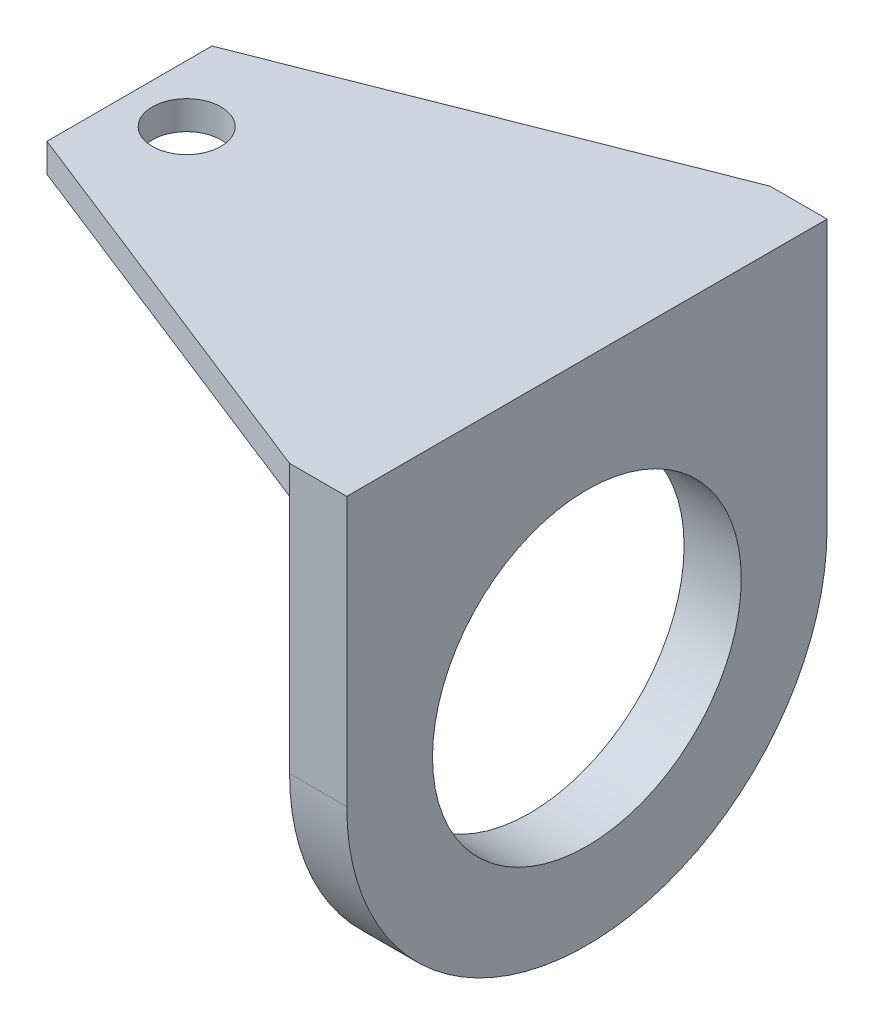
ISO-10303-21;
HEADER;
FILE_DESCRIPTION(('STEP AP214'),'2;1');
FILE_NAME('part.step','',(''),(''),'','','');
FILE_SCHEMA(('AUTOMOTIVE_DESIGN { 1 0 10303 214 1 1 1 1 }'));
ENDSEC;
DATA;
#1=APPLICATION_CONTEXT('core data for automotive mechanical design processes');
#2=APPLICATION_PROTOCOL_DEFINITION('international standard','automotive_design',2000,#1);
#3=PRODUCT_CONTEXT('',#1,'mechanical');
#4=PRODUCT('Part','Part','',(#3));
#5=PRODUCT_RELATED_PRODUCT_CATEGORY('part','',(#4));
#6=PRODUCT_DEFINITION_FORMATION('','',#4);
#7=PRODUCT_DEFINITION_CONTEXT('part definition',#1,'design');
#8=PRODUCT_DEFINITION('design','',#6,#7);
#9=PRODUCT_DEFINITION_SHAPE('','',#8);
#10=(LENGTH_UNIT() NAMED_UNIT(*) SI_UNIT(.MILLI.,.METRE.));
#11=(NAMED_UNIT(*) PLANE_ANGLE_UNIT() SI_UNIT($,.RADIAN.));
#12=(NAMED_UNIT(*) SI_UNIT($,.STERADIAN.) SOLID_ANGLE_UNIT());
#13=UNCERTAINTY_MEASURE_WITH_UNIT(LENGTH_MEASURE(1.E-05),#10,'distance_accuracy_value','');
#14=(GEOMETRIC_REPRESENTATION_CONTEXT(3) GLOBAL_UNCERTAINTY_ASSIGNED_CONTEXT((#13)) GLOBAL_UNIT_ASSIGNED_CONTEXT((#10,
#11,#12)) REPRESENTATION_CONTEXT('',''));
#15=CARTESIAN_POINT('',(0.,0.,0.));
#16=DIRECTION('',(0.,0.,1.));
#17=DIRECTION('',(1.,0.,0.));
#18=AXIS2_PLACEMENT_3D('',#15,#16,#17);
#19=CARTESIAN_POINT('',(0.,-21.001,21.));
#20=DIRECTION('',(0.,0.,-1.));
#21=DIRECTION('',(-1.,0.,0.));
#22=AXIS2_PLACEMENT_3D('',#19,#20,#21);
#23=PLANE('',#22);
#24=DIRECTION('',(0.,-1.,0.));
#25=VECTOR('',#24,1.);
#26=CARTESIAN_POINT('',(0.,23.5,21.));
#27=LINE('',#26,#25);
#28=CARTESIAN_POINT('',(0.,23.5,21.));
#29=VERTEX_POINT('',#28);
#30=CARTESIAN_POINT('',(0.,21.,21.));
#31=VERTEX_POINT('',#30);
#32=EDGE_CURVE('E50',#29,#31,#27,.T.);
#33=ORIENTED_EDGE('',*,*,#32,.T.);
#34=DIRECTION('',(0.,1.,0.));
#35=VECTOR('',#34,1.);
#36=CARTESIAN_POINT('',(0.,-21.001,21.));
#37=LINE('',#36,#35);
#38=CARTESIAN_POINT('',(0.,0.,21.));
#39=VERTEX_POINT('',#38);
#40=EDGE_CURVE('E145',#39,#31,#37,.T.);
#41=ORIENTED_EDGE('',*,*,#40,.F.);
#42=DIRECTION('',(-1.,0.,0.));
#43=VECTOR('',#42,1.);
#44=CARTESIAN_POINT('',(5.,0.,21.));
#45=LINE('',#44,#43);
#46=CARTESIAN_POINT('',(5.,0.,21.));
#47=VERTEX_POINT('',#46);
#48=EDGE_CURVE('E139',#39,#47,#45,.F.);
#49=ORIENTED_EDGE('',*,*,#48,.T.);
#50=DIRECTION('',(0.,1.,0.));
#51=VECTOR('',#50,1.);
#52=CARTESIAN_POINT('',(5.,-21.001,21.));
#53=LINE('',#52,#51);
#54=CARTESIAN_POINT('',(5.,23.5,21.));
#55=VERTEX_POINT('',#54);
#56=EDGE_CURVE('E142',#47,#55,#53,.T.);
#57=ORIENTED_EDGE('',*,*,#56,.T.);
#58=DIRECTION('',(-1.,0.,0.));
#59=VECTOR('',#58,1.);
#60=CARTESIAN_POINT('',(0.,23.5,21.));
#61=LINE('',#60,#59);
#62=EDGE_CURVE('E114',#55,#29,#61,.T.);
#63=ORIENTED_EDGE('',*,*,#62,.T.);
#64=EDGE_LOOP('',(#33,#41,#49,#57,#63));
#65=FACE_BOUND('',#64,.T.);
#66=ADVANCED_FACE('F35',(#65),#23,.F.);
#67=CARTESIAN_POINT('',(0.,-21.001,-21.));
#68=DIRECTION('',(0.,0.,1.));
#69=DIRECTION('',(1.,0.,0.));
#70=AXIS2_PLACEMENT_3D('',#67,#68,#69);
#71=PLANE('',#70);
#72=DIRECTION('',(0.,-1.,0.));
#73=VECTOR('',#72,1.);
#74=CARTESIAN_POINT('',(0.,23.5,-21.));
#75=LINE('',#74,#73);
#76=CARTESIAN_POINT('',(0.,23.5,-21.));
#77=VERTEX_POINT('',#76);
#78=CARTESIAN_POINT('',(0.,21.,-21.));
#79=VERTEX_POINT('',#78);
#80=EDGE_CURVE('E197',#77,#79,#75,.T.);
#81=ORIENTED_EDGE('',*,*,#80,.F.);
#82=DIRECTION('',(1.,0.,0.));
#83=VECTOR('',#82,1.);
#84=CARTESIAN_POINT('',(0.,23.5,-21.));
#85=LINE('',#84,#83);
#86=CARTESIAN_POINT('',(5.,23.5,-21.));
#87=VERTEX_POINT('',#86);
#88=EDGE_CURVE('E115',#77,#87,#85,.T.);
#89=ORIENTED_EDGE('',*,*,#88,.T.);
#90=DIRECTION('',(0.,1.,0.));
#91=VECTOR('',#90,1.);
#92=CARTESIAN_POINT('',(5.,-21.001,-21.));
#93=LINE('',#92,#91);
#94=CARTESIAN_POINT('',(5.,0.,-21.));
#95=VERTEX_POINT('',#94);
#96=EDGE_CURVE('E127',#95,#87,#93,.T.);
#97=ORIENTED_EDGE('',*,*,#96,.F.);
#98=DIRECTION('',(-1.,0.,0.));
#99=VECTOR('',#98,1.);
#100=CARTESIAN_POINT('',(5.,0.,-21.));
#101=LINE('',#100,#99);
#102=CARTESIAN_POINT('',(0.,0.,-21.));
#103=VERTEX_POINT('',#102);
#104=EDGE_CURVE('E136',#103,#95,#101,.F.);
#105=ORIENTED_EDGE('',*,*,#104,.F.);
#106=DIRECTION('',(0.,1.,0.));
#107=VECTOR('',#106,1.);
#108=CARTESIAN_POINT('',(0.,-21.001,-21.));
#109=LINE('',#108,#107);
#110=EDGE_CURVE('E133',#103,#79,#109,.T.);
#111=ORIENTED_EDGE('',*,*,#110,.T.);
#112=EDGE_LOOP('',(#81,#89,#97,#105,#111));
#113=FACE_BOUND('',#112,.T.);
#114=ADVANCED_FACE('F173',(#113),#71,.F.);
#115=CARTESIAN_POINT('',(0.,21.,0.));
#116=DIRECTION('',(0.,1.,0.));
#117=DIRECTION('',(0.,0.,1.));
#118=AXIS2_PLACEMENT_3D('',#115,#116,#117);
#119=PLANE('',#118);
#120=CARTESIAN_POINT('',(-30.,21.,0.));
#121=DIRECTION('',(0.,1.,0.));
#122=DIRECTION('',(0.,0.,1.));
#123=AXIS2_PLACEMENT_3D('',#120,#121,#122);
#124=CIRCLE('',#123,3.);
#125=CARTESIAN_POINT('',(-30.,21.,3.));
#126=VERTEX_POINT('',#125);
#127=EDGE_CURVE('E119',#126,#126,#124,.T.);
#128=ORIENTED_EDGE('',*,*,#127,.T.);
#129=EDGE_LOOP('',(#128));
#130=FACE_BOUND('',#129,.T.);
#131=DIRECTION('',(0.,0.,-1.));
#132=VECTOR('',#131,1.);
#133=CARTESIAN_POINT('',(-35.,21.,0.));
#134=LINE('',#133,#132);
#135=CARTESIAN_POINT('',(-35.,21.,7.21600945214453));
#136=VERTEX_POINT('',#135);
#137=CARTESIAN_POINT('',(-35.,21.,-7.21600945214453));
#138=VERTEX_POINT('',#137);
#139=EDGE_CURVE('E109',#136,#138,#134,.T.);
#140=ORIENTED_EDGE('',*,*,#139,.T.);
#141=DIRECTION('',(-0.930443637915585,0.,0.366435037438305));
#142=VECTOR('',#141,1.);
#143=CARTESIAN_POINT('',(-7.15989013517044,21.,-18.1802326300893));
#144=LINE('',#143,#142);
#145=EDGE_CURVE('E101',#79,#138,#144,.T.);
#146=ORIENTED_EDGE('',*,*,#145,.F.);
#147=DIRECTION('',(0.,0.,1.));
#148=VECTOR('',#147,1.);
#149=CARTESIAN_POINT('',(0.,21.,0.));
#150=LINE('',#149,#148);
#151=EDGE_CURVE('E138',#79,#31,#150,.T.);
#152=ORIENTED_EDGE('',*,*,#151,.T.);
#153=DIRECTION('',(-0.930443637915585,0.,-0.366435037438305));
#154=VECTOR('',#153,1.);
#155=CARTESIAN_POINT('',(-7.15989013517044,21.,18.1802326300893));
#156=LINE('',#155,#154);
#157=EDGE_CURVE('E200',#31,#136,#156,.T.);
#158=ORIENTED_EDGE('',*,*,#157,.T.);
#159=EDGE_LOOP('',(#140,#146,#152,#158));
#160=FACE_BOUND('',#159,.T.);
#161=ADVANCED_FACE('F178',(#130,#160),#119,.F.);
#162=CARTESIAN_POINT('',(-35.,23.5,0.));
#163=DIRECTION('',(-1.,0.,0.));
#164=DIRECTION('',(0.,0.,1.));
#165=AXIS2_PLACEMENT_3D('',#162,#163,#164);
#166=PLANE('',#165);
#167=DIRECTION('',(0.,-1.,0.));
#168=VECTOR('',#167,1.);
#169=CARTESIAN_POINT('',(-35.,23.5,-7.21600945214453));
#170=LINE('',#169,#168);
#171=CARTESIAN_POINT('',(-35.,23.5,-7.21600945214453));
#172=VERTEX_POINT('',#171);
#173=EDGE_CURVE('E58',#172,#138,#170,.T.);
#174=ORIENTED_EDGE('',*,*,#173,.T.);
#175=ORIENTED_EDGE('',*,*,#139,.F.);
#176=DIRECTION('',(0.,-1.,0.));
#177=VECTOR('',#176,1.);
#178=CARTESIAN_POINT('',(-35.,23.5,7.21600945214453));
#179=LINE('',#178,#177);
#180=CARTESIAN_POINT('',(-35.,23.5,7.21600945214453));
#181=VERTEX_POINT('',#180);
#182=EDGE_CURVE('E94',#181,#136,#179,.T.);
#183=ORIENTED_EDGE('',*,*,#182,.F.);
#184=DIRECTION('',(0.,0.,-1.));
#185=VECTOR('',#184,1.);
#186=CARTESIAN_POINT('',(-35.,23.5,0.));
#187=LINE('',#186,#185);
#188=EDGE_CURVE('E107',#181,#172,#187,.T.);
#189=ORIENTED_EDGE('',*,*,#188,.T.);
#190=EDGE_LOOP('',(#174,#175,#183,#189));
#191=FACE_BOUND('',#190,.T.);
#192=ADVANCED_FACE('F106',(#191),#166,.T.);
#193=CARTESIAN_POINT('',(0.,23.5,0.));
#194=DIRECTION('',(0.,1.,0.));
#195=DIRECTION('',(0.,0.,1.));
#196=AXIS2_PLACEMENT_3D('',#193,#194,#195);
#197=PLANE('',#196);
#198=DIRECTION('',(-0.930443637915585,0.,0.366435037438305));
#199=VECTOR('',#198,1.);
#200=CARTESIAN_POINT('',(-7.15989013517044,23.5,-18.1802326300893));
#201=LINE('',#200,#199);
#202=EDGE_CURVE('E100',#77,#172,#201,.T.);
#203=ORIENTED_EDGE('',*,*,#202,.T.);
#204=ORIENTED_EDGE('',*,*,#188,.F.);
#205=DIRECTION('',(-0.930443637915585,0.,-0.366435037438305));
#206=VECTOR('',#205,1.);
#207=CARTESIAN_POINT('',(-7.15989013517044,23.5,18.1802326300893));
#208=LINE('',#207,#206);
#209=EDGE_CURVE('E91',#29,#181,#208,.T.);
#210=ORIENTED_EDGE('',*,*,#209,.F.);
#211=ORIENTED_EDGE('',*,*,#62,.F.);
#212=DIRECTION('',(0.,0.,-1.));
#213=VECTOR('',#212,1.);
#214=CARTESIAN_POINT('',(5.,23.5,0.));
#215=LINE('',#214,#213);
#216=EDGE_CURVE('E117',#55,#87,#215,.T.);
#217=ORIENTED_EDGE('',*,*,#216,.T.);
#218=ORIENTED_EDGE('',*,*,#88,.F.);
#219=EDGE_LOOP('',(#203,#204,#210,#211,#217,#218));
#220=FACE_BOUND('',#219,.T.);
#221=CARTESIAN_POINT('',(-30.,23.5,0.));
#222=DIRECTION('',(0.,1.,0.));
#223=DIRECTION('',(0.,0.,1.));
#224=AXIS2_PLACEMENT_3D('',#221,#222,#223);
#225=CIRCLE('',#224,3.);
#226=CARTESIAN_POINT('',(-30.,23.5,3.));
#227=VERTEX_POINT('',#226);
#228=EDGE_CURVE('E124',#227,#227,#225,.T.);
#229=ORIENTED_EDGE('',*,*,#228,.F.);
#230=EDGE_LOOP('',(#229));
#231=FACE_BOUND('',#230,.T.);
#232=ADVANCED_FACE('F111',(#220,#231),#197,.T.);
#233=CARTESIAN_POINT('',(5.,0.,0.));
#234=DIRECTION('',(-1.,0.,0.));
#235=DIRECTION('',(0.,0.,1.));
#236=AXIS2_PLACEMENT_3D('',#233,#234,#235);
#237=CYLINDRICAL_SURFACE('',#236,21.);
#238=ORIENTED_EDGE('',*,*,#104,.T.);
#239=CARTESIAN_POINT('',(5.,0.,0.));
#240=DIRECTION('',(1.,0.,0.));
#241=DIRECTION('',(0.,0.,-1.));
#242=AXIS2_PLACEMENT_3D('',#239,#240,#241);
#243=CIRCLE('',#242,21.);
#244=EDGE_CURVE('E11',#47,#95,#243,.T.);
#245=ORIENTED_EDGE('',*,*,#244,.F.);
#246=ORIENTED_EDGE('',*,*,#48,.F.);
#247=CARTESIAN_POINT('',(0.,0.,0.));
#248=DIRECTION('',(1.,0.,0.));
#249=DIRECTION('',(0.,0.,-1.));
#250=AXIS2_PLACEMENT_3D('',#247,#248,#249);
#251=CIRCLE('',#250,21.);
#252=EDGE_CURVE('E39',#39,#103,#251,.T.);
#253=ORIENTED_EDGE('',*,*,#252,.T.);
#254=EDGE_LOOP('',(#238,#245,#246,#253));
#255=FACE_BOUND('',#254,.T.);
#256=ADVANCED_FACE('F37',(#255),#237,.T.);
#257=CARTESIAN_POINT('',(5.,0.,0.));
#258=DIRECTION('',(1.,0.,0.));
#259=DIRECTION('',(0.,0.,-1.));
#260=AXIS2_PLACEMENT_3D('',#257,#258,#259);
#261=PLANE('',#260);
#262=ORIENTED_EDGE('',*,*,#244,.T.);
#263=ORIENTED_EDGE('',*,*,#96,.T.);
#264=ORIENTED_EDGE('',*,*,#216,.F.);
#265=ORIENTED_EDGE('',*,*,#56,.F.);
#266=EDGE_LOOP('',(#262,#263,#264,#265));
#267=FACE_BOUND('',#266,.T.);
#268=CARTESIAN_POINT('',(5.,0.,0.));
#269=DIRECTION('',(1.,0.,0.));
#270=DIRECTION('',(0.,0.,-1.));
#271=AXIS2_PLACEMENT_3D('',#268,#269,#270);
#272=CIRCLE('',#271,13.5);
#273=CARTESIAN_POINT('',(5.,0.,-13.5));
#274=VERTEX_POINT('',#273);
#275=EDGE_CURVE('E149',#274,#274,#272,.T.);
#276=ORIENTED_EDGE('',*,*,#275,.F.);
#277=EDGE_LOOP('',(#276));
#278=FACE_BOUND('',#277,.T.);
#279=ADVANCED_FACE('F168',(#267,#278),#261,.T.);
#280=CARTESIAN_POINT('',(0.,0.,0.));
#281=DIRECTION('',(1.,0.,0.));
#282=DIRECTION('',(0.,0.,-1.));
#283=AXIS2_PLACEMENT_3D('',#280,#281,#282);
#284=PLANE('',#283);
#285=ORIENTED_EDGE('',*,*,#252,.F.);
#286=ORIENTED_EDGE('',*,*,#40,.T.);
#287=ORIENTED_EDGE('',*,*,#151,.F.);
#288=ORIENTED_EDGE('',*,*,#110,.F.);
#289=EDGE_LOOP('',(#285,#286,#287,#288));
#290=FACE_BOUND('',#289,.T.);
#291=CARTESIAN_POINT('',(0.,0.,0.));
#292=DIRECTION('',(1.,0.,0.));
#293=DIRECTION('',(0.,0.,-1.));
#294=AXIS2_PLACEMENT_3D('',#291,#292,#293);
#295=CIRCLE('',#294,13.5);
#296=CARTESIAN_POINT('',(0.,0.,-13.5));
#297=VERTEX_POINT('',#296);
#298=EDGE_CURVE('E141',#297,#297,#295,.T.);
#299=ORIENTED_EDGE('',*,*,#298,.T.);
#300=EDGE_LOOP('',(#299));
#301=FACE_BOUND('',#300,.T.);
#302=ADVANCED_FACE('F155',(#290,#301),#284,.F.);
#303=CARTESIAN_POINT('',(5.,0.,0.));
#304=DIRECTION('',(-1.,0.,0.));
#305=DIRECTION('',(0.,0.,1.));
#306=AXIS2_PLACEMENT_3D('',#303,#304,#305);
#307=CYLINDRICAL_SURFACE('',#306,13.5);
#308=ORIENTED_EDGE('',*,*,#275,.T.);
#309=EDGE_LOOP('',(#308));
#310=FACE_BOUND('',#309,.T.);
#311=ORIENTED_EDGE('',*,*,#298,.F.);
#312=EDGE_LOOP('',(#311));
#313=FACE_BOUND('',#312,.T.);
#314=ADVANCED_FACE('F157',(#310,#313),#307,.F.);
#315=CARTESIAN_POINT('',(-30.,23.5,0.));
#316=DIRECTION('',(0.,-1.,0.));
#317=DIRECTION('',(0.,0.,-1.));
#318=AXIS2_PLACEMENT_3D('',#315,#316,#317);
#319=CYLINDRICAL_SURFACE('',#318,3.);
#320=ORIENTED_EDGE('',*,*,#228,.T.);
#321=EDGE_LOOP('',(#320));
#322=FACE_BOUND('',#321,.T.);
#323=ORIENTED_EDGE('',*,*,#127,.F.);
#324=EDGE_LOOP('',(#323));
#325=FACE_BOUND('',#324,.T.);
#326=ADVANCED_FACE('F159',(#322,#325),#319,.F.);
#327=CARTESIAN_POINT('',(-7.15989013517044,23.5,18.1802326300893));
#328=DIRECTION('',(-0.366435037438305,0.,0.930443637915585));
#329=DIRECTION('',(0.930443637915585,0.,0.366435037438305));
#330=AXIS2_PLACEMENT_3D('',#327,#328,#329);
#331=PLANE('',#330);
#332=ORIENTED_EDGE('',*,*,#157,.F.);
#333=ORIENTED_EDGE('',*,*,#32,.F.);
#334=ORIENTED_EDGE('',*,*,#209,.T.);
#335=ORIENTED_EDGE('',*,*,#182,.T.);
#336=EDGE_LOOP('',(#332,#333,#334,#335));
#337=FACE_BOUND('',#336,.T.);
#338=ADVANCED_FACE('F93',(#337),#331,.T.);
#339=CARTESIAN_POINT('',(-7.15989013517044,23.5,-18.1802326300893));
#340=DIRECTION('',(0.366435037438305,0.,0.930443637915585));
#341=DIRECTION('',(0.930443637915585,0.,-0.366435037438305));
#342=AXIS2_PLACEMENT_3D('',#339,#340,#341);
#343=PLANE('',#342);
#344=ORIENTED_EDGE('',*,*,#145,.T.);
#345=ORIENTED_EDGE('',*,*,#173,.F.);
#346=ORIENTED_EDGE('',*,*,#202,.F.);
#347=ORIENTED_EDGE('',*,*,#80,.T.);
#348=EDGE_LOOP('',(#344,#345,#346,#347));
#349=FACE_BOUND('',#348,.T.);
#350=ADVANCED_FACE('F191',(#349),#343,.F.);
#351=CLOSED_SHELL('',(#66,#114,#161,#192,#232,#256,#279,#302,#314,#326,#338,#350));
#352=MANIFOLD_SOLID_BREP('B2',#351);
#353=ADVANCED_BREP_SHAPE_REPRESENTATION('',(#18,#352),#14);
#354=SHAPE_DEFINITION_REPRESENTATION(#9,#353);
ENDSEC;
END-ISO-10303-21;
